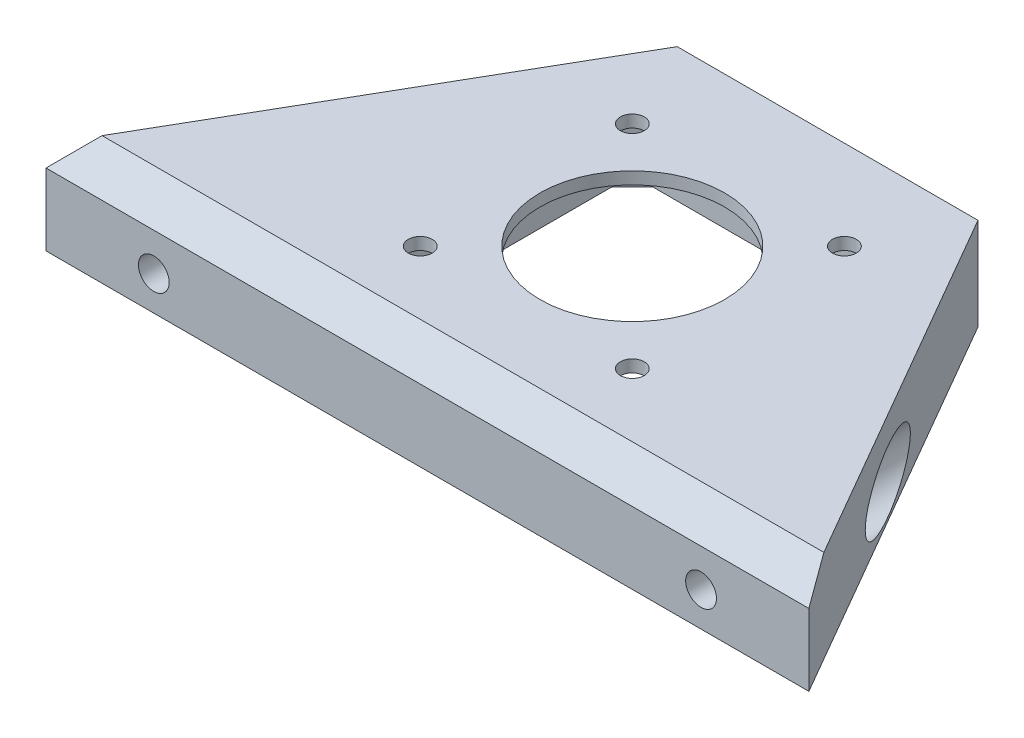
ISO-10303-21;
HEADER;
FILE_DESCRIPTION(('STEP AP214'),'2;1');
FILE_NAME('part.step','',(''),(''),'','','');
FILE_SCHEMA(('AUTOMOTIVE_DESIGN { 1 0 10303 214 1 1 1 1 }'));
ENDSEC;
DATA;
#1=APPLICATION_CONTEXT('core data for automotive mechanical design processes');
#2=APPLICATION_PROTOCOL_DEFINITION('international standard','automotive_design',2000,#1);
#3=PRODUCT_CONTEXT('',#1,'mechanical');
#4=PRODUCT('Part','Part','',(#3));
#5=PRODUCT_RELATED_PRODUCT_CATEGORY('part','',(#4));
#6=PRODUCT_DEFINITION_FORMATION('','',#4);
#7=PRODUCT_DEFINITION_CONTEXT('part definition',#1,'design');
#8=PRODUCT_DEFINITION('design','',#6,#7);
#9=PRODUCT_DEFINITION_SHAPE('','',#8);
#10=(LENGTH_UNIT() NAMED_UNIT(*) SI_UNIT(.MILLI.,.METRE.));
#11=(NAMED_UNIT(*) PLANE_ANGLE_UNIT() SI_UNIT($,.RADIAN.));
#12=(NAMED_UNIT(*) SI_UNIT($,.STERADIAN.) SOLID_ANGLE_UNIT());
#13=UNCERTAINTY_MEASURE_WITH_UNIT(LENGTH_MEASURE(1.E-05),#10,'distance_accuracy_value','');
#14=(GEOMETRIC_REPRESENTATION_CONTEXT(3) GLOBAL_UNCERTAINTY_ASSIGNED_CONTEXT((#13)) GLOBAL_UNIT_ASSIGNED_CONTEXT((#10,
#11,#12)) REPRESENTATION_CONTEXT('',''));
#15=CARTESIAN_POINT('',(0.,0.,0.));
#16=DIRECTION('',(0.,0.,1.));
#17=DIRECTION('',(1.,0.,0.));
#18=AXIS2_PLACEMENT_3D('',#15,#16,#17);
#19=CARTESIAN_POINT('',(-21.9839838486221,13.5,-60.));
#20=DIRECTION('',(0.866025403784436,0.,0.500000000000004));
#21=DIRECTION('',(0.500000000000004,0.,-0.866025403784436));
#22=AXIS2_PLACEMENT_3D('',#19,#20,#21);
#23=PLANE('',#22);
#24=CARTESIAN_POINT('',(-40.,5.,-28.7953446758323));
#25=DIRECTION('',(0.866025403784436,0.,0.500000000000004));
#26=DIRECTION('',(-0.500000000000004,0.,0.866025403784436));
#27=AXIS2_PLACEMENT_3D('',#24,#25,#26);
#28=ELLIPSE('',#27,8.99999999999993,4.5);
#29=CARTESIAN_POINT('',(-44.5,5.,-21.0011160417724));
#30=VERTEX_POINT('',#29);
#31=EDGE_CURVE('E253',#30,#30,#28,.T.);
#32=ORIENTED_EDGE('',*,*,#31,.T.);
#33=EDGE_LOOP('',(#32));
#34=FACE_BOUND('',#33,.T.);
#35=DIRECTION('',(0.,1.,0.));
#36=VECTOR('',#35,1.);
#37=CARTESIAN_POINT('',(-55.7589745962155,13.5,-1.50000000000003));
#38=LINE('',#37,#36);
#39=CARTESIAN_POINT('',(-55.7589745962155,0.,-1.50000000000002));
#40=VERTEX_POINT('',#39);
#41=CARTESIAN_POINT('',(-55.7589745962155,10.5,-1.50000000000003));
#42=VERTEX_POINT('',#41);
#43=EDGE_CURVE('E148',#40,#42,#38,.T.);
#44=ORIENTED_EDGE('',*,*,#43,.T.);
#45=DIRECTION('',(0.447213595499961,0.447213595499959,-0.774596669241481));
#46=VECTOR('',#45,1.);
#47=CARTESIAN_POINT('',(-55.9321796769724,10.3267949192431,-1.20000000000001));
#48=LINE('',#47,#46);
#49=CARTESIAN_POINT('',(-52.7589745962155,13.5,-6.69615242270665));
#50=VERTEX_POINT('',#49);
#51=EDGE_CURVE('E65',#42,#50,#48,.T.);
#52=ORIENTED_EDGE('',*,*,#51,.T.);
#53=DIRECTION('',(-0.500000000000004,0.,0.866025403784436));
#54=VECTOR('',#53,1.);
#55=CARTESIAN_POINT('',(-21.9839838486221,13.5,-60.));
#56=LINE('',#55,#54);
#57=CARTESIAN_POINT('',(-21.9839838486221,13.5,-60.));
#58=VERTEX_POINT('',#57);
#59=EDGE_CURVE('E169',#58,#50,#56,.T.);
#60=ORIENTED_EDGE('',*,*,#59,.F.);
#61=DIRECTION('',(0.,-1.,0.));
#62=VECTOR('',#61,1.);
#63=CARTESIAN_POINT('',(-21.9839838486221,13.5,-60.));
#64=LINE('',#63,#62);
#65=CARTESIAN_POINT('',(-21.9839838486221,0.,-60.));
#66=VERTEX_POINT('',#65);
#67=EDGE_CURVE('E175',#58,#66,#64,.T.);
#68=ORIENTED_EDGE('',*,*,#67,.T.);
#69=DIRECTION('',(-0.500000000000004,0.,0.866025403784436));
#70=VECTOR('',#69,1.);
#71=CARTESIAN_POINT('',(-21.9839838486221,0.,-60.));
#72=LINE('',#71,#70);
#73=EDGE_CURVE('E165',#66,#40,#72,.T.);
#74=ORIENTED_EDGE('',*,*,#73,.T.);
#75=EDGE_LOOP('',(#44,#52,#60,#68,#74));
#76=FACE_BOUND('',#75,.T.);
#77=ADVANCED_FACE('F40',(#34,#76),#23,.F.);
#78=CARTESIAN_POINT('',(56.625,13.5,0.));
#79=DIRECTION('',(-0.866025403784436,0.,0.500000000000004));
#80=DIRECTION('',(0.500000000000004,0.,0.866025403784436));
#81=AXIS2_PLACEMENT_3D('',#78,#79,#80);
#82=PLANE('',#81);
#83=CARTESIAN_POINT('',(40.,5.,-28.7953446758323));
#84=DIRECTION('',(-0.866025403784436,0.,0.500000000000004));
#85=DIRECTION('',(0.500000000000004,0.,0.866025403784436));
#86=AXIS2_PLACEMENT_3D('',#83,#84,#85);
#87=ELLIPSE('',#86,8.99999999999992,4.5);
#88=CARTESIAN_POINT('',(44.5,5.,-21.0011160417724));
#89=VERTEX_POINT('',#88);
#90=EDGE_CURVE('E249',#89,#89,#87,.T.);
#91=ORIENTED_EDGE('',*,*,#90,.T.);
#92=EDGE_LOOP('',(#91));
#93=FACE_BOUND('',#92,.T.);
#94=DIRECTION('',(-0.500000000000004,0.,-0.866025403784436));
#95=VECTOR('',#94,1.);
#96=CARTESIAN_POINT('',(56.625,13.5,0.));
#97=LINE('',#96,#95);
#98=CARTESIAN_POINT('',(52.7589745962155,13.5,-6.69615242270665));
#99=VERTEX_POINT('',#98);
#100=CARTESIAN_POINT('',(21.9839838486221,13.5,-60.));
#101=VERTEX_POINT('',#100);
#102=EDGE_CURVE('E335',#99,#101,#97,.T.);
#103=ORIENTED_EDGE('',*,*,#102,.F.);
#104=DIRECTION('',(0.447213595499961,-0.447213595499959,0.774596669241481));
#105=VECTOR('',#104,1.);
#106=CARTESIAN_POINT('',(33.2821796769721,32.9767949192433,-40.4309507914353));
#107=LINE('',#106,#105);
#108=CARTESIAN_POINT('',(55.7589745962156,10.5,-1.50000000000002));
#109=VERTEX_POINT('',#108);
#110=EDGE_CURVE('E12',#99,#109,#107,.T.);
#111=ORIENTED_EDGE('',*,*,#110,.T.);
#112=DIRECTION('',(0.,-1.,0.));
#113=VECTOR('',#112,1.);
#114=CARTESIAN_POINT('',(55.7589745962156,13.5,-1.50000000000002));
#115=LINE('',#114,#113);
#116=CARTESIAN_POINT('',(55.7589745962155,0.,-1.50000000000002));
#117=VERTEX_POINT('',#116);
#118=EDGE_CURVE('E136',#109,#117,#115,.T.);
#119=ORIENTED_EDGE('',*,*,#118,.T.);
#120=DIRECTION('',(-0.500000000000004,0.,-0.866025403784436));
#121=VECTOR('',#120,1.);
#122=CARTESIAN_POINT('',(56.625,0.,0.));
#123=LINE('',#122,#121);
#124=CARTESIAN_POINT('',(21.9839838486221,0.,-60.));
#125=VERTEX_POINT('',#124);
#126=EDGE_CURVE('E141',#117,#125,#123,.T.);
#127=ORIENTED_EDGE('',*,*,#126,.T.);
#128=DIRECTION('',(0.,-1.,0.));
#129=VECTOR('',#128,1.);
#130=CARTESIAN_POINT('',(21.9839838486221,13.5,-60.));
#131=LINE('',#130,#129);
#132=EDGE_CURVE('E179',#101,#125,#131,.T.);
#133=ORIENTED_EDGE('',*,*,#132,.F.);
#134=EDGE_LOOP('',(#103,#111,#119,#127,#133));
#135=FACE_BOUND('',#134,.T.);
#136=ADVANCED_FACE('F138',(#93,#135),#82,.F.);
#137=CARTESIAN_POINT('',(21.9839838486221,13.5,-60.));
#138=DIRECTION('',(0.,0.,1.));
#139=DIRECTION('',(1.,0.,0.));
#140=AXIS2_PLACEMENT_3D('',#137,#138,#139);
#141=PLANE('',#140);
#142=DIRECTION('',(-1.,0.,0.));
#143=VECTOR('',#142,1.);
#144=CARTESIAN_POINT('',(21.9839838486221,0.,-60.));
#145=LINE('',#144,#143);
#146=EDGE_CURVE('E163',#125,#66,#145,.T.);
#147=ORIENTED_EDGE('',*,*,#146,.T.);
#148=ORIENTED_EDGE('',*,*,#67,.F.);
#149=DIRECTION('',(-1.,0.,0.));
#150=VECTOR('',#149,1.);
#151=CARTESIAN_POINT('',(21.9839838486221,13.5,-60.));
#152=LINE('',#151,#150);
#153=EDGE_CURVE('E180',#101,#58,#152,.T.);
#154=ORIENTED_EDGE('',*,*,#153,.F.);
#155=ORIENTED_EDGE('',*,*,#132,.T.);
#156=EDGE_LOOP('',(#147,#148,#154,#155));
#157=FACE_BOUND('',#156,.T.);
#158=ADVANCED_FACE('F343',(#157),#141,.F.);
#159=CARTESIAN_POINT('',(0.,13.5,0.));
#160=DIRECTION('',(0.,1.,0.));
#161=DIRECTION('',(0.,0.,1.));
#162=AXIS2_PLACEMENT_3D('',#159,#160,#161);
#163=PLANE('',#162);
#164=CARTESIAN_POINT('',(-15.5,13.5,-46.95));
#165=DIRECTION('',(0.,1.,0.));
#166=DIRECTION('',(0.,0.,1.));
#167=AXIS2_PLACEMENT_3D('',#164,#165,#166);
#168=CIRCLE('',#167,1.75);
#169=CARTESIAN_POINT('',(-15.5,13.5,-45.2));
#170=VERTEX_POINT('',#169);
#171=EDGE_CURVE('E644',#170,#170,#168,.T.);
#172=ORIENTED_EDGE('',*,*,#171,.F.);
#173=EDGE_LOOP('',(#172));
#174=FACE_BOUND('',#173,.T.);
#175=CARTESIAN_POINT('',(-15.5,13.5,-15.95));
#176=DIRECTION('',(0.,1.,0.));
#177=DIRECTION('',(0.,0.,1.));
#178=AXIS2_PLACEMENT_3D('',#175,#176,#177);
#179=CIRCLE('',#178,1.75);
#180=CARTESIAN_POINT('',(-15.5,13.5,-14.2));
#181=VERTEX_POINT('',#180);
#182=EDGE_CURVE('E646',#181,#181,#179,.T.);
#183=ORIENTED_EDGE('',*,*,#182,.F.);
#184=EDGE_LOOP('',(#183));
#185=FACE_BOUND('',#184,.T.);
#186=CARTESIAN_POINT('',(15.5,13.5,-15.95));
#187=DIRECTION('',(0.,1.,0.));
#188=DIRECTION('',(0.,0.,1.));
#189=AXIS2_PLACEMENT_3D('',#186,#187,#188);
#190=CIRCLE('',#189,1.75);
#191=CARTESIAN_POINT('',(15.5,13.5,-14.2));
#192=VERTEX_POINT('',#191);
#193=EDGE_CURVE('E650',#192,#192,#190,.T.);
#194=ORIENTED_EDGE('',*,*,#193,.F.);
#195=EDGE_LOOP('',(#194));
#196=FACE_BOUND('',#195,.T.);
#197=CARTESIAN_POINT('',(15.5,13.5,-46.95));
#198=DIRECTION('',(0.,1.,0.));
#199=DIRECTION('',(0.,0.,1.));
#200=AXIS2_PLACEMENT_3D('',#197,#198,#199);
#201=CIRCLE('',#200,1.75);
#202=CARTESIAN_POINT('',(15.5,13.5,-45.2));
#203=VERTEX_POINT('',#202);
#204=EDGE_CURVE('E263',#203,#203,#201,.T.);
#205=ORIENTED_EDGE('',*,*,#204,.F.);
#206=EDGE_LOOP('',(#205));
#207=FACE_BOUND('',#206,.T.);
#208=ORIENTED_EDGE('',*,*,#59,.T.);
#209=DIRECTION('',(1.,0.,0.));
#210=VECTOR('',#209,1.);
#211=CARTESIAN_POINT('',(55.7589745962155,13.5,-6.69615242270665));
#212=LINE('',#211,#210);
#213=EDGE_CURVE('E50',#50,#99,#212,.T.);
#214=ORIENTED_EDGE('',*,*,#213,.T.);
#215=ORIENTED_EDGE('',*,*,#102,.T.);
#216=ORIENTED_EDGE('',*,*,#153,.T.);
#217=EDGE_LOOP('',(#208,#214,#215,#216));
#218=FACE_BOUND('',#217,.T.);
#219=CARTESIAN_POINT('',(0.,13.5,-31.45));
#220=DIRECTION('',(0.,-1.,0.));
#221=DIRECTION('',(0.,0.,-1.));
#222=AXIS2_PLACEMENT_3D('',#219,#220,#221);
#223=CIRCLE('',#222,13.5);
#224=CARTESIAN_POINT('',(0.,13.5,-44.95));
#225=VERTEX_POINT('',#224);
#226=EDGE_CURVE('E295',#225,#225,#223,.T.);
#227=ORIENTED_EDGE('',*,*,#226,.T.);
#228=EDGE_LOOP('',(#227));
#229=FACE_BOUND('',#228,.T.);
#230=ADVANCED_FACE('F340',(#174,#185,#196,#207,#218,#229),#163,.T.);
#231=CARTESIAN_POINT('',(0.,0.,0.));
#232=DIRECTION('',(0.,1.,0.));
#233=DIRECTION('',(0.,0.,1.));
#234=AXIS2_PLACEMENT_3D('',#231,#232,#233);
#235=PLANE('',#234);
#236=DIRECTION('',(0.,0.,-1.));
#237=VECTOR('',#236,1.);
#238=CARTESIAN_POINT('',(-22.5,0.,-53.95));
#239=LINE('',#238,#237);
#240=CARTESIAN_POINT('',(-22.5,0.,-11.95));
#241=VERTEX_POINT('',#240);
#242=CARTESIAN_POINT('',(-22.5,0.,-50.95));
#243=VERTEX_POINT('',#242);
#244=EDGE_CURVE('E308',#241,#243,#239,.T.);
#245=ORIENTED_EDGE('',*,*,#244,.F.);
#246=DIRECTION('',(-0.707106781186544,0.,-0.707106781186551));
#247=VECTOR('',#246,1.);
#248=CARTESIAN_POINT('',(-5.27500000000009,0.,5.27500000000005));
#249=LINE('',#248,#247);
#250=CARTESIAN_POINT('',(-19.5,0.,-8.94999999999999));
#251=VERTEX_POINT('',#250);
#252=EDGE_CURVE('E229',#241,#251,#249,.F.);
#253=ORIENTED_EDGE('',*,*,#252,.T.);
#254=DIRECTION('',(-1.,0.,0.));
#255=VECTOR('',#254,1.);
#256=CARTESIAN_POINT('',(22.5,0.,-8.94999999999999));
#257=LINE('',#256,#255);
#258=CARTESIAN_POINT('',(19.5,0.,-8.94999999999999));
#259=VERTEX_POINT('',#258);
#260=EDGE_CURVE('E312',#259,#251,#257,.T.);
#261=ORIENTED_EDGE('',*,*,#260,.F.);
#262=DIRECTION('',(-0.707106781186551,0.,0.707106781186544));
#263=VECTOR('',#262,1.);
#264=CARTESIAN_POINT('',(5.27499999999991,0.,5.27499999999996));
#265=LINE('',#264,#263);
#266=CARTESIAN_POINT('',(22.5,0.,-11.95));
#267=VERTEX_POINT('',#266);
#268=EDGE_CURVE('E226',#259,#267,#265,.F.);
#269=ORIENTED_EDGE('',*,*,#268,.T.);
#270=DIRECTION('',(0.,0.,1.));
#271=VECTOR('',#270,1.);
#272=CARTESIAN_POINT('',(22.5,0.,-53.95));
#273=LINE('',#272,#271);
#274=CARTESIAN_POINT('',(22.5,0.,-50.95));
#275=VERTEX_POINT('',#274);
#276=EDGE_CURVE('E299',#275,#267,#273,.T.);
#277=ORIENTED_EDGE('',*,*,#276,.F.);
#278=DIRECTION('',(0.707106781186544,0.,0.707106781186551));
#279=VECTOR('',#278,1.);
#280=CARTESIAN_POINT('',(36.7250000000001,0.,-36.7249999999998));
#281=LINE('',#280,#279);
#282=CARTESIAN_POINT('',(19.5,0.,-53.95));
#283=VERTEX_POINT('',#282);
#284=EDGE_CURVE('E223',#275,#283,#281,.F.);
#285=ORIENTED_EDGE('',*,*,#284,.T.);
#286=DIRECTION('',(1.,0.,0.));
#287=VECTOR('',#286,1.);
#288=CARTESIAN_POINT('',(22.5,0.,-53.95));
#289=LINE('',#288,#287);
#290=CARTESIAN_POINT('',(-19.5,0.,-53.95));
#291=VERTEX_POINT('',#290);
#292=EDGE_CURVE('E303',#291,#283,#289,.T.);
#293=ORIENTED_EDGE('',*,*,#292,.F.);
#294=DIRECTION('',(0.707106781186551,0.,-0.707106781186544));
#295=VECTOR('',#294,1.);
#296=CARTESIAN_POINT('',(-36.7249999999999,0.,-36.7250000000002));
#297=LINE('',#296,#295);
#298=EDGE_CURVE('E159',#291,#243,#297,.F.);
#299=ORIENTED_EDGE('',*,*,#298,.T.);
#300=EDGE_LOOP('',(#245,#253,#261,#269,#277,#285,#293,#299));
#301=FACE_BOUND('',#300,.T.);
#302=ORIENTED_EDGE('',*,*,#126,.F.);
#303=DIRECTION('',(-1.,0.,0.));
#304=VECTOR('',#303,1.);
#305=CARTESIAN_POINT('',(0.,0.,-1.50000000000002));
#306=LINE('',#305,#304);
#307=EDGE_CURVE('E152',#117,#40,#306,.T.);
#308=ORIENTED_EDGE('',*,*,#307,.T.);
#309=ORIENTED_EDGE('',*,*,#73,.F.);
#310=ORIENTED_EDGE('',*,*,#146,.F.);
#311=EDGE_LOOP('',(#302,#308,#309,#310));
#312=FACE_BOUND('',#311,.T.);
#313=ADVANCED_FACE('F162',(#301,#312),#235,.F.);
#314=CARTESIAN_POINT('',(0.,11.72,0.));
#315=DIRECTION('',(0.,1.,0.));
#316=DIRECTION('',(0.,0.,1.));
#317=AXIS2_PLACEMENT_3D('',#314,#315,#316);
#318=PLANE('',#317);
#319=CARTESIAN_POINT('',(-15.5,11.72,-46.95));
#320=DIRECTION('',(0.,1.,0.));
#321=DIRECTION('',(0.,0.,1.));
#322=AXIS2_PLACEMENT_3D('',#319,#320,#321);
#323=CIRCLE('',#322,1.75);
#324=CARTESIAN_POINT('',(-15.5,11.72,-45.2));
#325=VERTEX_POINT('',#324);
#326=EDGE_CURVE('E44',#325,#325,#323,.T.);
#327=ORIENTED_EDGE('',*,*,#326,.T.);
#328=EDGE_LOOP('',(#327));
#329=FACE_BOUND('',#328,.T.);
#330=CARTESIAN_POINT('',(-15.5,11.72,-15.95));
#331=DIRECTION('',(0.,1.,0.));
#332=DIRECTION('',(0.,0.,1.));
#333=AXIS2_PLACEMENT_3D('',#330,#331,#332);
#334=CIRCLE('',#333,1.75);
#335=CARTESIAN_POINT('',(-15.5,11.72,-14.2));
#336=VERTEX_POINT('',#335);
#337=EDGE_CURVE('E266',#336,#336,#334,.T.);
#338=ORIENTED_EDGE('',*,*,#337,.T.);
#339=EDGE_LOOP('',(#338));
#340=FACE_BOUND('',#339,.T.);
#341=CARTESIAN_POINT('',(15.5,11.72,-15.95));
#342=DIRECTION('',(0.,1.,0.));
#343=DIRECTION('',(0.,0.,1.));
#344=AXIS2_PLACEMENT_3D('',#341,#342,#343);
#345=CIRCLE('',#344,1.75);
#346=CARTESIAN_POINT('',(15.5,11.72,-14.2));
#347=VERTEX_POINT('',#346);
#348=EDGE_CURVE('E262',#347,#347,#345,.T.);
#349=ORIENTED_EDGE('',*,*,#348,.T.);
#350=EDGE_LOOP('',(#349));
#351=FACE_BOUND('',#350,.T.);
#352=CARTESIAN_POINT('',(15.5,11.72,-46.95));
#353=DIRECTION('',(0.,1.,0.));
#354=DIRECTION('',(0.,0.,1.));
#355=AXIS2_PLACEMENT_3D('',#352,#353,#354);
#356=CIRCLE('',#355,1.75);
#357=CARTESIAN_POINT('',(15.5,11.72,-45.2));
#358=VERTEX_POINT('',#357);
#359=EDGE_CURVE('E258',#358,#358,#356,.T.);
#360=ORIENTED_EDGE('',*,*,#359,.T.);
#361=EDGE_LOOP('',(#360));
#362=FACE_BOUND('',#361,.T.);
#363=CARTESIAN_POINT('',(0.,11.72,-31.45));
#364=DIRECTION('',(0.,-1.,0.));
#365=DIRECTION('',(0.,0.,-1.));
#366=AXIS2_PLACEMENT_3D('',#363,#364,#365);
#367=CIRCLE('',#366,13.5);
#368=CARTESIAN_POINT('',(0.,11.72,-44.95));
#369=VERTEX_POINT('',#368);
#370=EDGE_CURVE('E294',#369,#369,#367,.T.);
#371=ORIENTED_EDGE('',*,*,#370,.F.);
#372=EDGE_LOOP('',(#371));
#373=FACE_BOUND('',#372,.T.);
#374=DIRECTION('',(1.,0.,0.));
#375=VECTOR('',#374,1.);
#376=CARTESIAN_POINT('',(22.5,11.72,-53.95));
#377=LINE('',#376,#375);
#378=CARTESIAN_POINT('',(-19.5,11.72,-53.95));
#379=VERTEX_POINT('',#378);
#380=CARTESIAN_POINT('',(19.5,11.72,-53.95));
#381=VERTEX_POINT('',#380);
#382=EDGE_CURVE('E326',#379,#381,#377,.T.);
#383=ORIENTED_EDGE('',*,*,#382,.T.);
#384=DIRECTION('',(-0.707106781186544,0.,-0.707106781186551));
#385=VECTOR('',#384,1.);
#386=CARTESIAN_POINT('',(22.5,11.72,-50.95));
#387=LINE('',#386,#385);
#388=CARTESIAN_POINT('',(22.5,11.72,-50.95));
#389=VERTEX_POINT('',#388);
#390=EDGE_CURVE('E206',#381,#389,#387,.F.);
#391=ORIENTED_EDGE('',*,*,#390,.T.);
#392=DIRECTION('',(0.,0.,1.));
#393=VECTOR('',#392,1.);
#394=CARTESIAN_POINT('',(22.5,11.72,-53.95));
#395=LINE('',#394,#393);
#396=CARTESIAN_POINT('',(22.5,11.72,-11.95));
#397=VERTEX_POINT('',#396);
#398=EDGE_CURVE('E171',#389,#397,#395,.T.);
#399=ORIENTED_EDGE('',*,*,#398,.T.);
#400=DIRECTION('',(0.707106781186551,0.,-0.707106781186544));
#401=VECTOR('',#400,1.);
#402=CARTESIAN_POINT('',(19.5,11.72,-8.94999999999999));
#403=LINE('',#402,#401);
#404=CARTESIAN_POINT('',(19.5,11.72,-8.94999999999999));
#405=VERTEX_POINT('',#404);
#406=EDGE_CURVE('E203',#397,#405,#403,.F.);
#407=ORIENTED_EDGE('',*,*,#406,.T.);
#408=DIRECTION('',(-1.,0.,0.));
#409=VECTOR('',#408,1.);
#410=CARTESIAN_POINT('',(22.5,11.72,-8.94999999999999));
#411=LINE('',#410,#409);
#412=CARTESIAN_POINT('',(-19.5,11.72,-8.94999999999999));
#413=VERTEX_POINT('',#412);
#414=EDGE_CURVE('E307',#405,#413,#411,.T.);
#415=ORIENTED_EDGE('',*,*,#414,.T.);
#416=DIRECTION('',(0.707106781186544,0.,0.707106781186551));
#417=VECTOR('',#416,1.);
#418=CARTESIAN_POINT('',(-22.5,11.72,-11.95));
#419=LINE('',#418,#417);
#420=CARTESIAN_POINT('',(-22.5,11.72,-11.95));
#421=VERTEX_POINT('',#420);
#422=EDGE_CURVE('E200',#413,#421,#419,.F.);
#423=ORIENTED_EDGE('',*,*,#422,.T.);
#424=DIRECTION('',(0.,0.,-1.));
#425=VECTOR('',#424,1.);
#426=CARTESIAN_POINT('',(-22.5,11.72,-53.95));
#427=LINE('',#426,#425);
#428=CARTESIAN_POINT('',(-22.5,11.72,-50.95));
#429=VERTEX_POINT('',#428);
#430=EDGE_CURVE('E322',#421,#429,#427,.T.);
#431=ORIENTED_EDGE('',*,*,#430,.T.);
#432=DIRECTION('',(-0.707106781186551,0.,0.707106781186544));
#433=VECTOR('',#432,1.);
#434=CARTESIAN_POINT('',(-19.5,11.72,-53.95));
#435=LINE('',#434,#433);
#436=EDGE_CURVE('E197',#429,#379,#435,.F.);
#437=ORIENTED_EDGE('',*,*,#436,.T.);
#438=EDGE_LOOP('',(#383,#391,#399,#407,#415,#423,#431,#437));
#439=FACE_BOUND('',#438,.T.);
#440=ADVANCED_FACE('F379',(#329,#340,#351,#362,#373,#439),#318,.F.);
#441=CARTESIAN_POINT('',(22.5,77.1396103067893,-8.94999999999999));
#442=DIRECTION('',(0.,0.,1.));
#443=DIRECTION('',(1.,0.,0.));
#444=AXIS2_PLACEMENT_3D('',#441,#442,#443);
#445=PLANE('',#444);
#446=ORIENTED_EDGE('',*,*,#414,.F.);
#447=DIRECTION('',(0.,-1.,0.));
#448=VECTOR('',#447,1.);
#449=CARTESIAN_POINT('',(19.5,0.,-8.94999999999999));
#450=LINE('',#449,#448);
#451=EDGE_CURVE('E212',#405,#259,#450,.T.);
#452=ORIENTED_EDGE('',*,*,#451,.T.);
#453=ORIENTED_EDGE('',*,*,#260,.T.);
#454=DIRECTION('',(0.,1.,0.));
#455=VECTOR('',#454,1.);
#456=CARTESIAN_POINT('',(-19.5,11.72,-8.94999999999999));
#457=LINE('',#456,#455);
#458=EDGE_CURVE('E209',#251,#413,#457,.T.);
#459=ORIENTED_EDGE('',*,*,#458,.T.);
#460=EDGE_LOOP('',(#446,#452,#453,#459));
#461=FACE_BOUND('',#460,.T.);
#462=ADVANCED_FACE('F397',(#461),#445,.F.);
#463=CARTESIAN_POINT('',(-22.5,77.1396103067893,-53.95));
#464=DIRECTION('',(-1.,0.,0.));
#465=DIRECTION('',(0.,0.,1.));
#466=AXIS2_PLACEMENT_3D('',#463,#464,#465);
#467=PLANE('',#466);
#468=ORIENTED_EDGE('',*,*,#430,.F.);
#469=DIRECTION('',(0.,-1.,0.));
#470=VECTOR('',#469,1.);
#471=CARTESIAN_POINT('',(-22.5,0.,-11.95));
#472=LINE('',#471,#470);
#473=EDGE_CURVE('E219',#421,#241,#472,.T.);
#474=ORIENTED_EDGE('',*,*,#473,.T.);
#475=ORIENTED_EDGE('',*,*,#244,.T.);
#476=DIRECTION('',(0.,1.,0.));
#477=VECTOR('',#476,1.);
#478=CARTESIAN_POINT('',(-22.5,11.72,-50.95));
#479=LINE('',#478,#477);
#480=EDGE_CURVE('E216',#243,#429,#479,.T.);
#481=ORIENTED_EDGE('',*,*,#480,.T.);
#482=EDGE_LOOP('',(#468,#474,#475,#481));
#483=FACE_BOUND('',#482,.T.);
#484=ADVANCED_FACE('F402',(#483),#467,.F.);
#485=CARTESIAN_POINT('',(22.5,77.1396103067893,-53.95));
#486=DIRECTION('',(0.,0.,-1.));
#487=DIRECTION('',(-1.,0.,0.));
#488=AXIS2_PLACEMENT_3D('',#485,#486,#487);
#489=PLANE('',#488);
#490=ORIENTED_EDGE('',*,*,#292,.T.);
#491=DIRECTION('',(0.,1.,0.));
#492=VECTOR('',#491,1.);
#493=CARTESIAN_POINT('',(19.5,11.72,-53.95));
#494=LINE('',#493,#492);
#495=EDGE_CURVE('E194',#283,#381,#494,.T.);
#496=ORIENTED_EDGE('',*,*,#495,.T.);
#497=ORIENTED_EDGE('',*,*,#382,.F.);
#498=DIRECTION('',(0.,-1.,0.));
#499=VECTOR('',#498,1.);
#500=CARTESIAN_POINT('',(-19.5,0.,-53.95));
#501=LINE('',#500,#499);
#502=EDGE_CURVE('E190',#379,#291,#501,.T.);
#503=ORIENTED_EDGE('',*,*,#502,.T.);
#504=EDGE_LOOP('',(#490,#496,#497,#503));
#505=FACE_BOUND('',#504,.T.);
#506=ADVANCED_FACE('F383',(#505),#489,.F.);
#507=CARTESIAN_POINT('',(22.5,77.1396103067893,-53.95));
#508=DIRECTION('',(1.,0.,0.));
#509=DIRECTION('',(0.,0.,-1.));
#510=AXIS2_PLACEMENT_3D('',#507,#508,#509);
#511=PLANE('',#510);
#512=ORIENTED_EDGE('',*,*,#398,.F.);
#513=DIRECTION('',(0.,-1.,0.));
#514=VECTOR('',#513,1.);
#515=CARTESIAN_POINT('',(22.5,0.,-50.95));
#516=LINE('',#515,#514);
#517=EDGE_CURVE('E186',#389,#275,#516,.T.);
#518=ORIENTED_EDGE('',*,*,#517,.T.);
#519=ORIENTED_EDGE('',*,*,#276,.T.);
#520=DIRECTION('',(0.,1.,0.));
#521=VECTOR('',#520,1.);
#522=CARTESIAN_POINT('',(22.5,11.72,-11.95));
#523=LINE('',#522,#521);
#524=EDGE_CURVE('E183',#267,#397,#523,.T.);
#525=ORIENTED_EDGE('',*,*,#524,.T.);
#526=EDGE_LOOP('',(#512,#518,#519,#525));
#527=FACE_BOUND('',#526,.T.);
#528=ADVANCED_FACE('F390',(#527),#511,.F.);
#529=CARTESIAN_POINT('',(0.,13.5,-31.45));
#530=DIRECTION('',(0.,-1.,0.));
#531=DIRECTION('',(0.,0.,-1.));
#532=AXIS2_PLACEMENT_3D('',#529,#530,#531);
#533=CYLINDRICAL_SURFACE('',#532,13.5);
#534=ORIENTED_EDGE('',*,*,#226,.F.);
#535=EDGE_LOOP('',(#534));
#536=FACE_BOUND('',#535,.T.);
#537=ORIENTED_EDGE('',*,*,#370,.T.);
#538=EDGE_LOOP('',(#537));
#539=FACE_BOUND('',#538,.T.);
#540=ADVANCED_FACE('F358',(#536,#539),#533,.F.);
#541=CARTESIAN_POINT('',(22.5,77.1396103067893,-50.95));
#542=DIRECTION('',(-0.707106781186551,0.,0.707106781186544));
#543=DIRECTION('',(0.,1.,0.));
#544=AXIS2_PLACEMENT_3D('',#541,#542,#543);
#545=PLANE('',#544);
#546=ORIENTED_EDGE('',*,*,#390,.F.);
#547=ORIENTED_EDGE('',*,*,#495,.F.);
#548=ORIENTED_EDGE('',*,*,#284,.F.);
#549=ORIENTED_EDGE('',*,*,#517,.F.);
#550=EDGE_LOOP('',(#546,#547,#548,#549));
#551=FACE_BOUND('',#550,.T.);
#552=ADVANCED_FACE('F354',(#551),#545,.T.);
#553=CARTESIAN_POINT('',(19.5,77.1396103067893,-8.94999999999999));
#554=DIRECTION('',(-0.707106781186544,0.,-0.707106781186551));
#555=DIRECTION('',(0.,1.,0.));
#556=AXIS2_PLACEMENT_3D('',#553,#554,#555);
#557=PLANE('',#556);
#558=ORIENTED_EDGE('',*,*,#406,.F.);
#559=ORIENTED_EDGE('',*,*,#524,.F.);
#560=ORIENTED_EDGE('',*,*,#268,.F.);
#561=ORIENTED_EDGE('',*,*,#451,.F.);
#562=EDGE_LOOP('',(#558,#559,#560,#561));
#563=FACE_BOUND('',#562,.T.);
#564=ADVANCED_FACE('F357',(#563),#557,.T.);
#565=CARTESIAN_POINT('',(-22.5,77.1396103067893,-11.95));
#566=DIRECTION('',(0.70710678118655,0.,-0.707106781186544));
#567=DIRECTION('',(0.,1.,0.));
#568=AXIS2_PLACEMENT_3D('',#565,#566,#567);
#569=PLANE('',#568);
#570=ORIENTED_EDGE('',*,*,#422,.F.);
#571=ORIENTED_EDGE('',*,*,#458,.F.);
#572=ORIENTED_EDGE('',*,*,#252,.F.);
#573=ORIENTED_EDGE('',*,*,#473,.F.);
#574=EDGE_LOOP('',(#570,#571,#572,#573));
#575=FACE_BOUND('',#574,.T.);
#576=ADVANCED_FACE('F362',(#575),#569,.T.);
#577=CARTESIAN_POINT('',(-19.5,77.1396103067893,-53.95));
#578=DIRECTION('',(0.707106781186544,0.,0.707106781186551));
#579=DIRECTION('',(0.,1.,0.));
#580=AXIS2_PLACEMENT_3D('',#577,#578,#579);
#581=PLANE('',#580);
#582=ORIENTED_EDGE('',*,*,#436,.F.);
#583=ORIENTED_EDGE('',*,*,#480,.F.);
#584=ORIENTED_EDGE('',*,*,#298,.F.);
#585=ORIENTED_EDGE('',*,*,#502,.F.);
#586=EDGE_LOOP('',(#582,#583,#584,#585));
#587=FACE_BOUND('',#586,.T.);
#588=ADVANCED_FACE('F365',(#587),#581,.T.);
#589=CARTESIAN_POINT('',(-56.625,0.,-1.50000000000002));
#590=DIRECTION('',(0.,0.,-1.));
#591=DIRECTION('',(-1.,0.,0.));
#592=AXIS2_PLACEMENT_3D('',#589,#590,#591);
#593=PLANE('',#592);
#594=CARTESIAN_POINT('',(-40.,5.,-1.50000000000002));
#595=DIRECTION('',(0.,0.,1.));
#596=DIRECTION('',(1.,0.,0.));
#597=AXIS2_PLACEMENT_3D('',#594,#595,#596);
#598=CIRCLE('',#597,2.25);
#599=CARTESIAN_POINT('',(-37.75,5.,-1.50000000000002));
#600=VERTEX_POINT('',#599);
#601=EDGE_CURVE('E149',#600,#600,#598,.T.);
#602=ORIENTED_EDGE('',*,*,#601,.F.);
#603=EDGE_LOOP('',(#602));
#604=FACE_BOUND('',#603,.T.);
#605=CARTESIAN_POINT('',(40.,5.,-1.50000000000002));
#606=DIRECTION('',(0.,0.,1.));
#607=DIRECTION('',(1.,0.,0.));
#608=AXIS2_PLACEMENT_3D('',#605,#606,#607);
#609=CIRCLE('',#608,2.25);
#610=CARTESIAN_POINT('',(42.25,5.,-1.50000000000002));
#611=VERTEX_POINT('',#610);
#612=EDGE_CURVE('E257',#611,#611,#609,.T.);
#613=ORIENTED_EDGE('',*,*,#612,.F.);
#614=EDGE_LOOP('',(#613));
#615=FACE_BOUND('',#614,.T.);
#616=ORIENTED_EDGE('',*,*,#118,.F.);
#617=DIRECTION('',(-1.,0.,0.));
#618=VECTOR('',#617,1.);
#619=CARTESIAN_POINT('',(-55.7589745962155,10.5,-1.50000000000002));
#620=LINE('',#619,#618);
#621=EDGE_CURVE('E158',#109,#42,#620,.T.);
#622=ORIENTED_EDGE('',*,*,#621,.T.);
#623=ORIENTED_EDGE('',*,*,#43,.F.);
#624=ORIENTED_EDGE('',*,*,#307,.F.);
#625=EDGE_LOOP('',(#616,#622,#623,#624));
#626=FACE_BOUND('',#625,.T.);
#627=ADVANCED_FACE('F153',(#604,#615,#626),#593,.F.);
#628=CARTESIAN_POINT('',(-56.625,10.5,-1.50000000000002));
#629=DIRECTION('',(0.,0.866025403784437,0.500000000000002));
#630=DIRECTION('',(1.,0.,0.));
#631=AXIS2_PLACEMENT_3D('',#628,#629,#630);
#632=PLANE('',#631);
#633=ORIENTED_EDGE('',*,*,#110,.F.);
#634=ORIENTED_EDGE('',*,*,#213,.F.);
#635=ORIENTED_EDGE('',*,*,#51,.F.);
#636=ORIENTED_EDGE('',*,*,#621,.F.);
#637=EDGE_LOOP('',(#633,#634,#635,#636));
#638=FACE_BOUND('',#637,.T.);
#639=ADVANCED_FACE('F42',(#638),#632,.T.);
#640=CARTESIAN_POINT('',(40.,5.,-60.));
#641=DIRECTION('',(0.,0.,1.));
#642=DIRECTION('',(1.,0.,0.));
#643=AXIS2_PLACEMENT_3D('',#640,#641,#642);
#644=CYLINDRICAL_SURFACE('',#643,2.25);
#645=CARTESIAN_POINT('',(40.,5.,-5.50000000000002));
#646=DIRECTION('',(0.,0.,1.));
#647=DIRECTION('',(1.,0.,0.));
#648=AXIS2_PLACEMENT_3D('',#645,#646,#647);
#649=CIRCLE('',#648,2.25);
#650=CARTESIAN_POINT('',(42.25,5.,-5.50000000000002));
#651=VERTEX_POINT('',#650);
#652=EDGE_CURVE('E244',#651,#651,#649,.F.);
#653=ORIENTED_EDGE('',*,*,#652,.T.);
#654=EDGE_LOOP('',(#653));
#655=FACE_BOUND('',#654,.T.);
#656=ORIENTED_EDGE('',*,*,#612,.T.);
#657=EDGE_LOOP('',(#656));
#658=FACE_BOUND('',#657,.T.);
#659=ADVANCED_FACE('F502',(#655,#658),#644,.F.);
#660=CARTESIAN_POINT('',(-40.,5.,-60.));
#661=DIRECTION('',(0.,0.,1.));
#662=DIRECTION('',(1.,0.,0.));
#663=AXIS2_PLACEMENT_3D('',#660,#661,#662);
#664=CYLINDRICAL_SURFACE('',#663,2.25);
#665=CARTESIAN_POINT('',(-40.,5.,-5.50000000000002));
#666=DIRECTION('',(0.,0.,1.));
#667=DIRECTION('',(1.,0.,0.));
#668=AXIS2_PLACEMENT_3D('',#665,#666,#667);
#669=CIRCLE('',#668,2.25);
#670=CARTESIAN_POINT('',(-37.75,5.,-5.50000000000002));
#671=VERTEX_POINT('',#670);
#672=EDGE_CURVE('E240',#671,#671,#669,.F.);
#673=ORIENTED_EDGE('',*,*,#672,.T.);
#674=EDGE_LOOP('',(#673));
#675=FACE_BOUND('',#674,.T.);
#676=ORIENTED_EDGE('',*,*,#601,.T.);
#677=EDGE_LOOP('',(#676));
#678=FACE_BOUND('',#677,.T.);
#679=ADVANCED_FACE('F494',(#675,#678),#664,.F.);
#680=CARTESIAN_POINT('',(-40.,5.,-60.));
#681=DIRECTION('',(0.,0.,1.));
#682=DIRECTION('',(1.,0.,0.));
#683=AXIS2_PLACEMENT_3D('',#680,#681,#682);
#684=CYLINDRICAL_SURFACE('',#683,4.5);
#685=CARTESIAN_POINT('',(-40.,5.,-5.50000000000002));
#686=DIRECTION('',(0.,0.,1.));
#687=DIRECTION('',(1.,0.,0.));
#688=AXIS2_PLACEMENT_3D('',#685,#686,#687);
#689=CIRCLE('',#688,4.5);
#690=CARTESIAN_POINT('',(-35.5,5.,-5.50000000000002));
#691=VERTEX_POINT('',#690);
#692=EDGE_CURVE('E245',#691,#691,#689,.T.);
#693=ORIENTED_EDGE('',*,*,#692,.T.);
#694=EDGE_LOOP('',(#693));
#695=FACE_BOUND('',#694,.T.);
#696=ORIENTED_EDGE('',*,*,#31,.F.);
#697=EDGE_LOOP('',(#696));
#698=FACE_BOUND('',#697,.T.);
#699=ADVANCED_FACE('F490',(#695,#698),#684,.F.);
#700=CARTESIAN_POINT('',(-40.,5.,-5.50000000000002));
#701=DIRECTION('',(0.,0.,1.));
#702=DIRECTION('',(1.,0.,0.));
#703=AXIS2_PLACEMENT_3D('',#700,#701,#702);
#704=PLANE('',#703);
#705=ORIENTED_EDGE('',*,*,#692,.F.);
#706=EDGE_LOOP('',(#705));
#707=FACE_BOUND('',#706,.T.);
#708=ORIENTED_EDGE('',*,*,#672,.F.);
#709=EDGE_LOOP('',(#708));
#710=FACE_BOUND('',#709,.T.);
#711=ADVANCED_FACE('F486',(#707,#710),#704,.F.);
#712=CARTESIAN_POINT('',(40.,5.,-60.));
#713=DIRECTION('',(0.,0.,1.));
#714=DIRECTION('',(1.,0.,0.));
#715=AXIS2_PLACEMENT_3D('',#712,#713,#714);
#716=CYLINDRICAL_SURFACE('',#715,4.5);
#717=CARTESIAN_POINT('',(40.,5.,-5.50000000000002));
#718=DIRECTION('',(0.,0.,1.));
#719=DIRECTION('',(1.,0.,0.));
#720=AXIS2_PLACEMENT_3D('',#717,#718,#719);
#721=CIRCLE('',#720,4.5);
#722=CARTESIAN_POINT('',(44.5,5.,-5.50000000000002));
#723=VERTEX_POINT('',#722);
#724=EDGE_CURVE('E273',#723,#723,#721,.T.);
#725=ORIENTED_EDGE('',*,*,#724,.T.);
#726=EDGE_LOOP('',(#725));
#727=FACE_BOUND('',#726,.T.);
#728=ORIENTED_EDGE('',*,*,#90,.F.);
#729=EDGE_LOOP('',(#728));
#730=FACE_BOUND('',#729,.T.);
#731=ADVANCED_FACE('F489',(#727,#730),#716,.F.);
#732=CARTESIAN_POINT('',(40.,5.,-5.50000000000002));
#733=DIRECTION('',(0.,0.,1.));
#734=DIRECTION('',(1.,0.,0.));
#735=AXIS2_PLACEMENT_3D('',#732,#733,#734);
#736=PLANE('',#735);
#737=ORIENTED_EDGE('',*,*,#724,.F.);
#738=EDGE_LOOP('',(#737));
#739=FACE_BOUND('',#738,.T.);
#740=ORIENTED_EDGE('',*,*,#652,.F.);
#741=EDGE_LOOP('',(#740));
#742=FACE_BOUND('',#741,.T.);
#743=ADVANCED_FACE('F431',(#739,#742),#736,.F.);
#744=CARTESIAN_POINT('',(15.5,0.,-46.95));
#745=DIRECTION('',(0.,1.,0.));
#746=DIRECTION('',(0.,0.,1.));
#747=AXIS2_PLACEMENT_3D('',#744,#745,#746);
#748=CYLINDRICAL_SURFACE('',#747,1.75);
#749=ORIENTED_EDGE('',*,*,#204,.T.);
#750=EDGE_LOOP('',(#749));
#751=FACE_BOUND('',#750,.T.);
#752=ORIENTED_EDGE('',*,*,#359,.F.);
#753=EDGE_LOOP('',(#752));
#754=FACE_BOUND('',#753,.T.);
#755=ADVANCED_FACE('F444',(#751,#754),#748,.F.);
#756=CARTESIAN_POINT('',(15.5,0.,-15.95));
#757=DIRECTION('',(0.,1.,0.));
#758=DIRECTION('',(0.,0.,1.));
#759=AXIS2_PLACEMENT_3D('',#756,#757,#758);
#760=CYLINDRICAL_SURFACE('',#759,1.75);
#761=ORIENTED_EDGE('',*,*,#193,.T.);
#762=EDGE_LOOP('',(#761));
#763=FACE_BOUND('',#762,.T.);
#764=ORIENTED_EDGE('',*,*,#348,.F.);
#765=EDGE_LOOP('',(#764));
#766=FACE_BOUND('',#765,.T.);
#767=ADVANCED_FACE('F449',(#763,#766),#760,.F.);
#768=CARTESIAN_POINT('',(-15.5,0.,-15.95));
#769=DIRECTION('',(0.,1.,0.));
#770=DIRECTION('',(0.,0.,1.));
#771=AXIS2_PLACEMENT_3D('',#768,#769,#770);
#772=CYLINDRICAL_SURFACE('',#771,1.75);
#773=ORIENTED_EDGE('',*,*,#182,.T.);
#774=EDGE_LOOP('',(#773));
#775=FACE_BOUND('',#774,.T.);
#776=ORIENTED_EDGE('',*,*,#337,.F.);
#777=EDGE_LOOP('',(#776));
#778=FACE_BOUND('',#777,.T.);
#779=ADVANCED_FACE('F459',(#775,#778),#772,.F.);
#780=CARTESIAN_POINT('',(-15.5,0.,-46.95));
#781=DIRECTION('',(0.,1.,0.));
#782=DIRECTION('',(0.,0.,1.));
#783=AXIS2_PLACEMENT_3D('',#780,#781,#782);
#784=CYLINDRICAL_SURFACE('',#783,1.75);
#785=ORIENTED_EDGE('',*,*,#171,.T.);
#786=EDGE_LOOP('',(#785));
#787=FACE_BOUND('',#786,.T.);
#788=ORIENTED_EDGE('',*,*,#326,.F.);
#789=EDGE_LOOP('',(#788));
#790=FACE_BOUND('',#789,.T.);
#791=ADVANCED_FACE('F469',(#787,#790),#784,.F.);
#792=CLOSED_SHELL('',(#77,#136,#158,#230,#313,#440,#462,#484,#506,#528,#540,#552,#564,#576,#588,
#627,#639,#659,#679,#699,#711,#731,#743,#755,#767,#779,#791));
#793=MANIFOLD_SOLID_BREP('B2',#792);
#794=ADVANCED_BREP_SHAPE_REPRESENTATION('',(#18,#793),#14);
#795=SHAPE_DEFINITION_REPRESENTATION(#9,#794);
ENDSEC;
END-ISO-10303-21;
